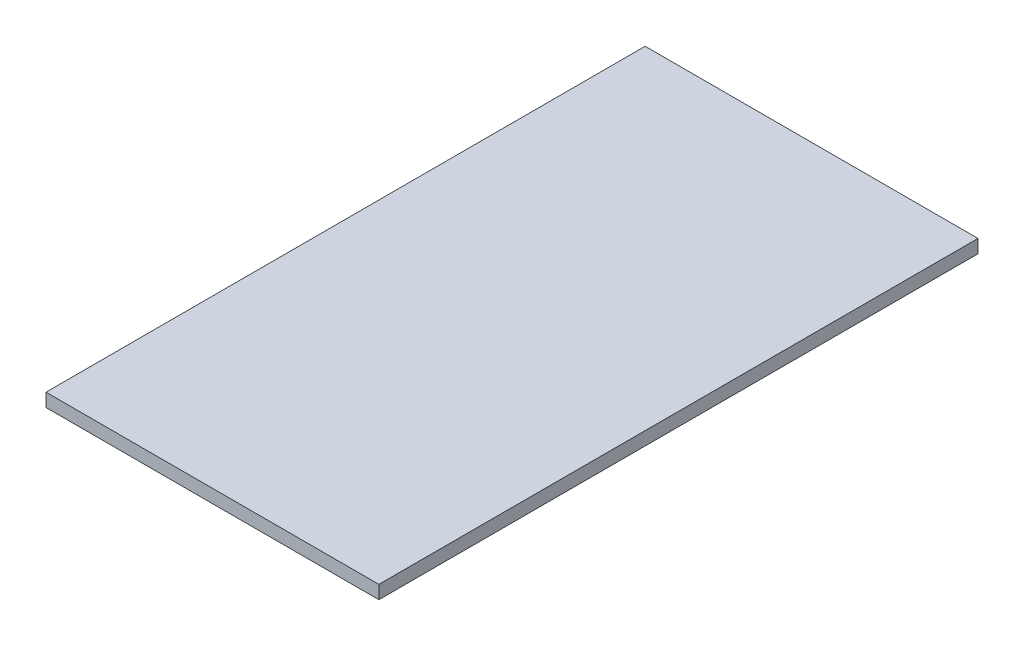
ISO-10303-21;
HEADER;
FILE_DESCRIPTION(('STEP AP214'),'2;1');
FILE_NAME('part.step','',(''),(''),'','','');
FILE_SCHEMA(('AUTOMOTIVE_DESIGN { 1 0 10303 214 1 1 1 1 }'));
ENDSEC;
DATA;
#1=APPLICATION_CONTEXT('core data for automotive mechanical design processes');
#2=APPLICATION_PROTOCOL_DEFINITION('international standard','automotive_design',2000,#1);
#3=PRODUCT_CONTEXT('',#1,'mechanical');
#4=PRODUCT('Part','Part','',(#3));
#5=PRODUCT_RELATED_PRODUCT_CATEGORY('part','',(#4));
#6=PRODUCT_DEFINITION_FORMATION('','',#4);
#7=PRODUCT_DEFINITION_CONTEXT('part definition',#1,'design');
#8=PRODUCT_DEFINITION('design','',#6,#7);
#9=PRODUCT_DEFINITION_SHAPE('','',#8);
#10=(LENGTH_UNIT() NAMED_UNIT(*) SI_UNIT(.MILLI.,.METRE.));
#11=(NAMED_UNIT(*) PLANE_ANGLE_UNIT() SI_UNIT($,.RADIAN.));
#12=(NAMED_UNIT(*) SI_UNIT($,.STERADIAN.) SOLID_ANGLE_UNIT());
#13=UNCERTAINTY_MEASURE_WITH_UNIT(LENGTH_MEASURE(1.E-05),#10,'distance_accuracy_value','');
#14=(GEOMETRIC_REPRESENTATION_CONTEXT(3) GLOBAL_UNCERTAINTY_ASSIGNED_CONTEXT((#13)) GLOBAL_UNIT_ASSIGNED_CONTEXT((#10,
#11,#12)) REPRESENTATION_CONTEXT('',''));
#15=CARTESIAN_POINT('',(0.,0.,0.));
#16=DIRECTION('',(0.,0.,1.));
#17=DIRECTION('',(1.,0.,0.));
#18=AXIS2_PLACEMENT_3D('',#15,#16,#17);
#19=CARTESIAN_POINT('',(25.,2.,45.));
#20=DIRECTION('',(-1.,0.,0.));
#21=DIRECTION('',(0.,0.,1.));
#22=AXIS2_PLACEMENT_3D('',#19,#20,#21);
#23=PLANE('',#22);
#24=DIRECTION('',(0.,0.,-1.));
#25=VECTOR('',#24,1.);
#26=CARTESIAN_POINT('',(25.,0.,45.));
#27=LINE('',#26,#25);
#28=CARTESIAN_POINT('',(25.,0.,45.));
#29=VERTEX_POINT('',#28);
#30=CARTESIAN_POINT('',(25.,0.,-45.));
#31=VERTEX_POINT('',#30);
#32=EDGE_CURVE('E99',#29,#31,#27,.T.);
#33=ORIENTED_EDGE('',*,*,#32,.T.);
#34=DIRECTION('',(0.,-1.,0.));
#35=VECTOR('',#34,1.);
#36=CARTESIAN_POINT('',(25.,2.,-45.));
#37=LINE('',#36,#35);
#38=CARTESIAN_POINT('',(25.,2.,-45.));
#39=VERTEX_POINT('',#38);
#40=EDGE_CURVE('E11',#39,#31,#37,.T.);
#41=ORIENTED_EDGE('',*,*,#40,.F.);
#42=DIRECTION('',(0.,0.,-1.));
#43=VECTOR('',#42,1.);
#44=CARTESIAN_POINT('',(25.,2.,45.));
#45=LINE('',#44,#43);
#46=CARTESIAN_POINT('',(25.,2.,45.));
#47=VERTEX_POINT('',#46);
#48=EDGE_CURVE('E87',#47,#39,#45,.T.);
#49=ORIENTED_EDGE('',*,*,#48,.F.);
#50=DIRECTION('',(0.,-1.,0.));
#51=VECTOR('',#50,1.);
#52=CARTESIAN_POINT('',(25.,2.,45.));
#53=LINE('',#52,#51);
#54=EDGE_CURVE('E95',#47,#29,#53,.T.);
#55=ORIENTED_EDGE('',*,*,#54,.T.);
#56=EDGE_LOOP('',(#33,#41,#49,#55));
#57=FACE_BOUND('',#56,.T.);
#58=ADVANCED_FACE('F36',(#57),#23,.F.);
#59=CARTESIAN_POINT('',(-25.,2.,-45.));
#60=DIRECTION('',(0.,0.,1.));
#61=DIRECTION('',(1.,0.,0.));
#62=AXIS2_PLACEMENT_3D('',#59,#60,#61);
#63=PLANE('',#62);
#64=DIRECTION('',(-1.,0.,0.));
#65=VECTOR('',#64,1.);
#66=CARTESIAN_POINT('',(-25.,0.,-45.));
#67=LINE('',#66,#65);
#68=CARTESIAN_POINT('',(-25.,0.,-45.));
#69=VERTEX_POINT('',#68);
#70=EDGE_CURVE('E91',#31,#69,#67,.T.);
#71=ORIENTED_EDGE('',*,*,#70,.T.);
#72=DIRECTION('',(0.,-1.,0.));
#73=VECTOR('',#72,1.);
#74=CARTESIAN_POINT('',(-25.,2.,-45.));
#75=LINE('',#74,#73);
#76=CARTESIAN_POINT('',(-25.,2.,-45.));
#77=VERTEX_POINT('',#76);
#78=EDGE_CURVE('E44',#77,#69,#75,.T.);
#79=ORIENTED_EDGE('',*,*,#78,.F.);
#80=DIRECTION('',(-1.,0.,0.));
#81=VECTOR('',#80,1.);
#82=CARTESIAN_POINT('',(-25.,2.,-45.));
#83=LINE('',#82,#81);
#84=EDGE_CURVE('E82',#39,#77,#83,.T.);
#85=ORIENTED_EDGE('',*,*,#84,.F.);
#86=ORIENTED_EDGE('',*,*,#40,.T.);
#87=EDGE_LOOP('',(#71,#79,#85,#86));
#88=FACE_BOUND('',#87,.T.);
#89=ADVANCED_FACE('F90',(#88),#63,.F.);
#90=CARTESIAN_POINT('',(-25.,2.,45.));
#91=DIRECTION('',(1.,0.,0.));
#92=DIRECTION('',(0.,0.,-1.));
#93=AXIS2_PLACEMENT_3D('',#90,#91,#92);
#94=PLANE('',#93);
#95=DIRECTION('',(0.,0.,1.));
#96=VECTOR('',#95,1.);
#97=CARTESIAN_POINT('',(-25.,0.,45.));
#98=LINE('',#97,#96);
#99=CARTESIAN_POINT('',(-25.,0.,45.));
#100=VERTEX_POINT('',#99);
#101=EDGE_CURVE('E69',#69,#100,#98,.T.);
#102=ORIENTED_EDGE('',*,*,#101,.T.);
#103=DIRECTION('',(0.,-1.,0.));
#104=VECTOR('',#103,1.);
#105=CARTESIAN_POINT('',(-25.,2.,45.));
#106=LINE('',#105,#104);
#107=CARTESIAN_POINT('',(-25.,2.,45.));
#108=VERTEX_POINT('',#107);
#109=EDGE_CURVE('E92',#108,#100,#106,.T.);
#110=ORIENTED_EDGE('',*,*,#109,.F.);
#111=DIRECTION('',(0.,0.,1.));
#112=VECTOR('',#111,1.);
#113=CARTESIAN_POINT('',(-25.,2.,45.));
#114=LINE('',#113,#112);
#115=EDGE_CURVE('E85',#77,#108,#114,.T.);
#116=ORIENTED_EDGE('',*,*,#115,.F.);
#117=ORIENTED_EDGE('',*,*,#78,.T.);
#118=EDGE_LOOP('',(#102,#110,#116,#117));
#119=FACE_BOUND('',#118,.T.);
#120=ADVANCED_FACE('F93',(#119),#94,.F.);
#121=CARTESIAN_POINT('',(-25.,2.,45.));
#122=DIRECTION('',(0.,0.,-1.));
#123=DIRECTION('',(-1.,0.,0.));
#124=AXIS2_PLACEMENT_3D('',#121,#122,#123);
#125=PLANE('',#124);
#126=DIRECTION('',(1.,0.,0.));
#127=VECTOR('',#126,1.);
#128=CARTESIAN_POINT('',(-25.,0.,45.));
#129=LINE('',#128,#127);
#130=EDGE_CURVE('E75',#100,#29,#129,.T.);
#131=ORIENTED_EDGE('',*,*,#130,.T.);
#132=ORIENTED_EDGE('',*,*,#54,.F.);
#133=DIRECTION('',(1.,0.,0.));
#134=VECTOR('',#133,1.);
#135=CARTESIAN_POINT('',(-25.,2.,45.));
#136=LINE('',#135,#134);
#137=EDGE_CURVE('E52',#108,#47,#136,.T.);
#138=ORIENTED_EDGE('',*,*,#137,.F.);
#139=ORIENTED_EDGE('',*,*,#109,.T.);
#140=EDGE_LOOP('',(#131,#132,#138,#139));
#141=FACE_BOUND('',#140,.T.);
#142=ADVANCED_FACE('F106',(#141),#125,.F.);
#143=CARTESIAN_POINT('',(0.,2.,0.));
#144=DIRECTION('',(0.,-1.,0.));
#145=DIRECTION('',(0.,0.,-1.));
#146=AXIS2_PLACEMENT_3D('',#143,#144,#145);
#147=PLANE('',#146);
#148=ORIENTED_EDGE('',*,*,#48,.T.);
#149=ORIENTED_EDGE('',*,*,#84,.T.);
#150=ORIENTED_EDGE('',*,*,#115,.T.);
#151=ORIENTED_EDGE('',*,*,#137,.T.);
#152=EDGE_LOOP('',(#148,#149,#150,#151));
#153=FACE_BOUND('',#152,.T.);
#154=ADVANCED_FACE('F83',(#153),#147,.F.);
#155=CARTESIAN_POINT('',(0.,0.,0.));
#156=DIRECTION('',(0.,-1.,0.));
#157=DIRECTION('',(0.,0.,-1.));
#158=AXIS2_PLACEMENT_3D('',#155,#156,#157);
#159=PLANE('',#158);
#160=ORIENTED_EDGE('',*,*,#32,.F.);
#161=ORIENTED_EDGE('',*,*,#130,.F.);
#162=ORIENTED_EDGE('',*,*,#101,.F.);
#163=ORIENTED_EDGE('',*,*,#70,.F.);
#164=EDGE_LOOP('',(#160,#161,#162,#163));
#165=FACE_BOUND('',#164,.T.);
#166=ADVANCED_FACE('F109',(#165),#159,.T.);
#167=CLOSED_SHELL('',(#58,#89,#120,#142,#154,#166));
#168=MANIFOLD_SOLID_BREP('B2',#167);
#169=ADVANCED_BREP_SHAPE_REPRESENTATION('',(#18,#168),#14);
#170=SHAPE_DEFINITION_REPRESENTATION(#9,#169);
ENDSEC;
END-ISO-10303-21;
